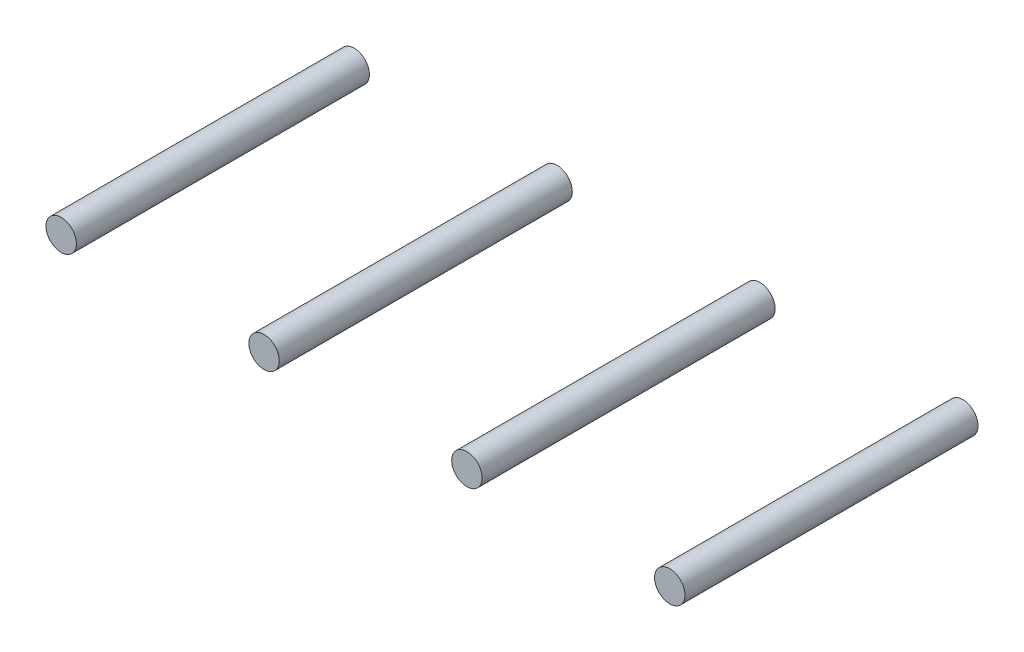
ISO-10303-21;
HEADER;
FILE_DESCRIPTION(('STEP AP214'),'2;1');
FILE_NAME('part.step','',(''),(''),'','','');
FILE_SCHEMA(('AUTOMOTIVE_DESIGN { 1 0 10303 214 1 1 1 1 }'));
ENDSEC;
DATA;
#1=APPLICATION_CONTEXT('core data for automotive mechanical design processes');
#2=APPLICATION_PROTOCOL_DEFINITION('international standard','automotive_design',2000,#1);
#3=PRODUCT_CONTEXT('',#1,'mechanical');
#4=PRODUCT('Part','Part','',(#3));
#5=PRODUCT_RELATED_PRODUCT_CATEGORY('part','',(#4));
#6=PRODUCT_DEFINITION_FORMATION('','',#4);
#7=PRODUCT_DEFINITION_CONTEXT('part definition',#1,'design');
#8=PRODUCT_DEFINITION('design','',#6,#7);
#9=PRODUCT_DEFINITION_SHAPE('','',#8);
#10=(LENGTH_UNIT() NAMED_UNIT(*) SI_UNIT(.MILLI.,.METRE.));
#11=(NAMED_UNIT(*) PLANE_ANGLE_UNIT() SI_UNIT($,.RADIAN.));
#12=(NAMED_UNIT(*) SI_UNIT($,.STERADIAN.) SOLID_ANGLE_UNIT());
#13=UNCERTAINTY_MEASURE_WITH_UNIT(LENGTH_MEASURE(1.E-05),#10,'distance_accuracy_value','');
#14=(GEOMETRIC_REPRESENTATION_CONTEXT(3) GLOBAL_UNCERTAINTY_ASSIGNED_CONTEXT((#13)) GLOBAL_UNIT_ASSIGNED_CONTEXT((#10,
#11,#12)) REPRESENTATION_CONTEXT('',''));
#15=CARTESIAN_POINT('',(0.,0.,0.));
#16=DIRECTION('',(0.,0.,1.));
#17=DIRECTION('',(1.,0.,0.));
#18=AXIS2_PLACEMENT_3D('',#15,#16,#17);
#19=CARTESIAN_POINT('',(0.,0.,-16.));
#20=DIRECTION('',(0.,0.,-1.));
#21=DIRECTION('',(0.,-1.,0.));
#22=AXIS2_PLACEMENT_3D('',#19,#20,#21);
#23=PLANE('',#22);
#24=CARTESIAN_POINT('',(9.,-35.,-16.));
#25=DIRECTION('',(0.,0.,-1.));
#26=DIRECTION('',(0.,1.,0.));
#27=AXIS2_PLACEMENT_3D('',#24,#25,#26);
#28=CIRCLE('',#27,1.35);
#29=CARTESIAN_POINT('',(9.,-33.65,-16.));
#30=VERTEX_POINT('',#29);
#31=EDGE_CURVE('E11',#30,#30,#28,.F.);
#32=ORIENTED_EDGE('',*,*,#31,.F.);
#33=EDGE_LOOP('',(#32));
#34=FACE_BOUND('',#33,.T.);
#35=ADVANCED_FACE('F40',(#34),#23,.T.);
#36=CARTESIAN_POINT('',(9.,-35.,-19.8183766184073));
#37=DIRECTION('',(0.,0.,1.));
#38=DIRECTION('',(1.,0.,0.));
#39=AXIS2_PLACEMENT_3D('',#36,#37,#38);
#40=CYLINDRICAL_SURFACE('',#39,1.35);
#41=ORIENTED_EDGE('',*,*,#31,.T.);
#42=EDGE_LOOP('',(#41));
#43=FACE_BOUND('',#42,.T.);
#44=CARTESIAN_POINT('',(9.,-35.,10.));
#45=DIRECTION('',(0.,0.,1.));
#46=DIRECTION('',(-1.,0.,0.));
#47=AXIS2_PLACEMENT_3D('',#44,#45,#46);
#48=CIRCLE('',#47,1.35);
#49=CARTESIAN_POINT('',(7.65,-35.,10.));
#50=VERTEX_POINT('',#49);
#51=EDGE_CURVE('E46',#50,#50,#48,.T.);
#52=ORIENTED_EDGE('',*,*,#51,.F.);
#53=EDGE_LOOP('',(#52));
#54=FACE_BOUND('',#53,.T.);
#55=ADVANCED_FACE('F54',(#43,#54),#40,.T.);
#56=CARTESIAN_POINT('',(9.,-35.,10.));
#57=DIRECTION('',(0.,0.,-1.));
#58=DIRECTION('',(-1.,0.,0.));
#59=AXIS2_PLACEMENT_3D('',#56,#57,#58);
#60=PLANE('',#59);
#61=ORIENTED_EDGE('',*,*,#51,.T.);
#62=EDGE_LOOP('',(#61));
#63=FACE_BOUND('',#62,.T.);
#64=ADVANCED_FACE('F52',(#63),#60,.F.);
#65=CLOSED_SHELL('',(#35,#55,#64));
#66=MANIFOLD_SOLID_BREP('B2',#65);
#67=CARTESIAN_POINT('',(0.,0.,-16.));
#68=DIRECTION('',(0.,0.,-1.));
#69=DIRECTION('',(0.,-1.,0.));
#70=AXIS2_PLACEMENT_3D('',#67,#68,#69);
#71=PLANE('',#70);
#72=CARTESIAN_POINT('',(-9.,-35.,-16.));
#73=DIRECTION('',(0.,0.,-1.));
#74=DIRECTION('',(0.,1.,0.));
#75=AXIS2_PLACEMENT_3D('',#72,#73,#74);
#76=CIRCLE('',#75,1.35);
#77=CARTESIAN_POINT('',(-9.,-33.65,-16.));
#78=VERTEX_POINT('',#77);
#79=EDGE_CURVE('E39',#78,#78,#76,.F.);
#80=ORIENTED_EDGE('',*,*,#79,.F.);
#81=EDGE_LOOP('',(#80));
#82=FACE_BOUND('',#81,.T.);
#83=ADVANCED_FACE('F89',(#82),#71,.T.);
#84=CARTESIAN_POINT('',(-9.,-35.,-19.8183766184073));
#85=DIRECTION('',(0.,0.,1.));
#86=DIRECTION('',(1.,0.,0.));
#87=AXIS2_PLACEMENT_3D('',#84,#85,#86);
#88=CYLINDRICAL_SURFACE('',#87,1.35);
#89=ORIENTED_EDGE('',*,*,#79,.T.);
#90=EDGE_LOOP('',(#89));
#91=FACE_BOUND('',#90,.T.);
#92=CARTESIAN_POINT('',(-9.,-35.,10.));
#93=DIRECTION('',(0.,0.,1.));
#94=DIRECTION('',(1.,0.,0.));
#95=AXIS2_PLACEMENT_3D('',#92,#93,#94);
#96=CIRCLE('',#95,1.35);
#97=CARTESIAN_POINT('',(-7.65,-35.,10.));
#98=VERTEX_POINT('',#97);
#99=EDGE_CURVE('E95',#98,#98,#96,.T.);
#100=ORIENTED_EDGE('',*,*,#99,.F.);
#101=EDGE_LOOP('',(#100));
#102=FACE_BOUND('',#101,.T.);
#103=ADVANCED_FACE('F103',(#91,#102),#88,.T.);
#104=CARTESIAN_POINT('',(-9.,-35.,10.));
#105=DIRECTION('',(0.,0.,1.));
#106=DIRECTION('',(1.,0.,0.));
#107=AXIS2_PLACEMENT_3D('',#104,#105,#106);
#108=PLANE('',#107);
#109=ORIENTED_EDGE('',*,*,#99,.T.);
#110=EDGE_LOOP('',(#109));
#111=FACE_BOUND('',#110,.T.);
#112=ADVANCED_FACE('F101',(#111),#108,.T.);
#113=CLOSED_SHELL('',(#83,#103,#112));
#114=MANIFOLD_SOLID_BREP('B6',#113);
#115=CARTESIAN_POINT('',(0.,0.,-16.));
#116=DIRECTION('',(0.,0.,-1.));
#117=DIRECTION('',(0.,-1.,0.));
#118=AXIS2_PLACEMENT_3D('',#115,#116,#117);
#119=PLANE('',#118);
#120=CARTESIAN_POINT('',(-27.,-35.,-16.));
#121=DIRECTION('',(0.,0.,-1.));
#122=DIRECTION('',(0.,1.,0.));
#123=AXIS2_PLACEMENT_3D('',#120,#121,#122);
#124=CIRCLE('',#123,1.35);
#125=CARTESIAN_POINT('',(-27.,-33.65,-16.));
#126=VERTEX_POINT('',#125);
#127=EDGE_CURVE('E88',#126,#126,#124,.F.);
#128=ORIENTED_EDGE('',*,*,#127,.F.);
#129=EDGE_LOOP('',(#128));
#130=FACE_BOUND('',#129,.T.);
#131=ADVANCED_FACE('F137',(#130),#119,.T.);
#132=CARTESIAN_POINT('',(-27.,-35.,-19.8183766184073));
#133=DIRECTION('',(0.,0.,1.));
#134=DIRECTION('',(1.,0.,0.));
#135=AXIS2_PLACEMENT_3D('',#132,#133,#134);
#136=CYLINDRICAL_SURFACE('',#135,1.35);
#137=ORIENTED_EDGE('',*,*,#127,.T.);
#138=EDGE_LOOP('',(#137));
#139=FACE_BOUND('',#138,.T.);
#140=CARTESIAN_POINT('',(-27.,-35.,10.));
#141=DIRECTION('',(0.,0.,1.));
#142=DIRECTION('',(1.,0.,0.));
#143=AXIS2_PLACEMENT_3D('',#140,#141,#142);
#144=CIRCLE('',#143,1.35);
#145=CARTESIAN_POINT('',(-25.65,-35.,10.));
#146=VERTEX_POINT('',#145);
#147=EDGE_CURVE('E143',#146,#146,#144,.T.);
#148=ORIENTED_EDGE('',*,*,#147,.F.);
#149=EDGE_LOOP('',(#148));
#150=FACE_BOUND('',#149,.T.);
#151=ADVANCED_FACE('F151',(#139,#150),#136,.T.);
#152=CARTESIAN_POINT('',(-27.,-35.,10.));
#153=DIRECTION('',(0.,0.,1.));
#154=DIRECTION('',(1.,0.,0.));
#155=AXIS2_PLACEMENT_3D('',#152,#153,#154);
#156=PLANE('',#155);
#157=ORIENTED_EDGE('',*,*,#147,.T.);
#158=EDGE_LOOP('',(#157));
#159=FACE_BOUND('',#158,.T.);
#160=ADVANCED_FACE('F149',(#159),#156,.T.);
#161=CLOSED_SHELL('',(#131,#151,#160));
#162=MANIFOLD_SOLID_BREP('B34',#161);
#163=CARTESIAN_POINT('',(27.,-35.,-19.8183766184073));
#164=DIRECTION('',(0.,0.,1.));
#165=DIRECTION('',(1.,0.,0.));
#166=AXIS2_PLACEMENT_3D('',#163,#164,#165);
#167=CYLINDRICAL_SURFACE('',#166,1.35);
#168=CARTESIAN_POINT('',(27.,-35.,-16.));
#169=DIRECTION('',(0.,0.,-1.));
#170=DIRECTION('',(0.,1.,0.));
#171=AXIS2_PLACEMENT_3D('',#168,#169,#170);
#172=CIRCLE('',#171,1.35);
#173=CARTESIAN_POINT('',(27.,-33.65,-16.));
#174=VERTEX_POINT('',#173);
#175=EDGE_CURVE('E136',#174,#174,#172,.F.);
#176=ORIENTED_EDGE('',*,*,#175,.T.);
#177=EDGE_LOOP('',(#176));
#178=FACE_BOUND('',#177,.T.);
#179=CARTESIAN_POINT('',(27.,-35.,10.));
#180=DIRECTION('',(0.,0.,1.));
#181=DIRECTION('',(-1.,0.,0.));
#182=AXIS2_PLACEMENT_3D('',#179,#180,#181);
#183=CIRCLE('',#182,1.35);
#184=CARTESIAN_POINT('',(25.65,-35.,10.));
#185=VERTEX_POINT('',#184);
#186=EDGE_CURVE('E184',#185,#185,#183,.T.);
#187=ORIENTED_EDGE('',*,*,#186,.F.);
#188=EDGE_LOOP('',(#187));
#189=FACE_BOUND('',#188,.T.);
#190=ADVANCED_FACE('F178',(#178,#189),#167,.T.);
#191=CARTESIAN_POINT('',(0.,0.,-16.));
#192=DIRECTION('',(0.,0.,-1.));
#193=DIRECTION('',(0.,-1.,0.));
#194=AXIS2_PLACEMENT_3D('',#191,#192,#193);
#195=PLANE('',#194);
#196=ORIENTED_EDGE('',*,*,#175,.F.);
#197=EDGE_LOOP('',(#196));
#198=FACE_BOUND('',#197,.T.);
#199=ADVANCED_FACE('F193',(#198),#195,.T.);
#200=CARTESIAN_POINT('',(27.,-35.,10.));
#201=DIRECTION('',(0.,0.,-1.));
#202=DIRECTION('',(-1.,0.,0.));
#203=AXIS2_PLACEMENT_3D('',#200,#201,#202);
#204=PLANE('',#203);
#205=ORIENTED_EDGE('',*,*,#186,.T.);
#206=EDGE_LOOP('',(#205));
#207=FACE_BOUND('',#206,.T.);
#208=ADVANCED_FACE('F190',(#207),#204,.F.);
#209=CLOSED_SHELL('',(#190,#199,#208));
#210=MANIFOLD_SOLID_BREP('B83',#209);
#211=ADVANCED_BREP_SHAPE_REPRESENTATION('',(#18,#66,#114,#162,#210),#14);
#212=SHAPE_DEFINITION_REPRESENTATION(#9,#211);
ENDSEC;
END-ISO-10303-21;
